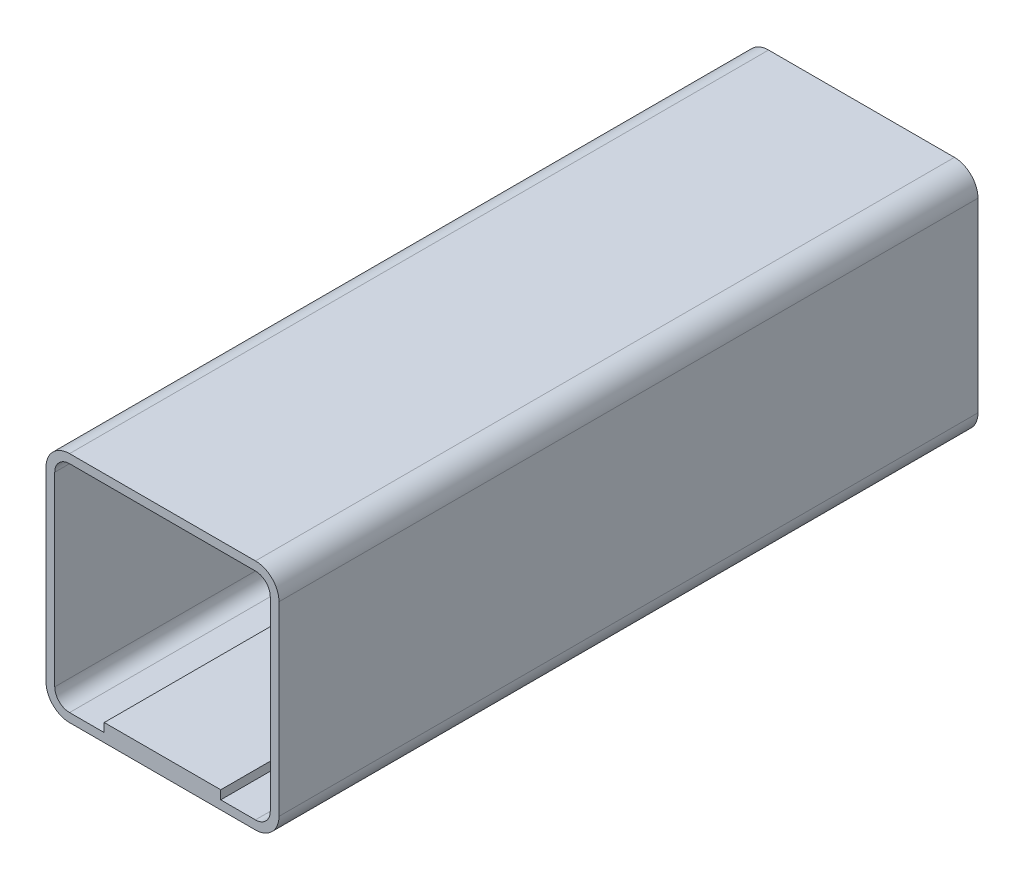
ISO-10303-21;
HEADER;
FILE_DESCRIPTION(('STEP AP214'),'2;1');
FILE_NAME('part.step','',(''),(''),'','','');
FILE_SCHEMA(('AUTOMOTIVE_DESIGN { 1 0 10303 214 1 1 1 1 }'));
ENDSEC;
DATA;
#1=APPLICATION_CONTEXT('core data for automotive mechanical design processes');
#2=APPLICATION_PROTOCOL_DEFINITION('international standard','automotive_design',2000,#1);
#3=PRODUCT_CONTEXT('',#1,'mechanical');
#4=PRODUCT('Part','Part','',(#3));
#5=PRODUCT_RELATED_PRODUCT_CATEGORY('part','',(#4));
#6=PRODUCT_DEFINITION_FORMATION('','',#4);
#7=PRODUCT_DEFINITION_CONTEXT('part definition',#1,'design');
#8=PRODUCT_DEFINITION('design','',#6,#7);
#9=PRODUCT_DEFINITION_SHAPE('','',#8);
#10=(LENGTH_UNIT() NAMED_UNIT(*) SI_UNIT(.MILLI.,.METRE.));
#11=(NAMED_UNIT(*) PLANE_ANGLE_UNIT() SI_UNIT($,.RADIAN.));
#12=(NAMED_UNIT(*) SI_UNIT($,.STERADIAN.) SOLID_ANGLE_UNIT());
#13=UNCERTAINTY_MEASURE_WITH_UNIT(LENGTH_MEASURE(1.E-05),#10,'distance_accuracy_value','');
#14=(GEOMETRIC_REPRESENTATION_CONTEXT(3) GLOBAL_UNCERTAINTY_ASSIGNED_CONTEXT((#13)) GLOBAL_UNIT_ASSIGNED_CONTEXT((#10,
#11,#12)) REPRESENTATION_CONTEXT('',''));
#15=CARTESIAN_POINT('',(0.,0.,0.));
#16=DIRECTION('',(0.,0.,1.));
#17=DIRECTION('',(1.,0.,0.));
#18=AXIS2_PLACEMENT_3D('',#15,#16,#17);
#19=CARTESIAN_POINT('',(-50.6524288909317,-58.7375,-381.));
#20=DIRECTION('',(0.,-1.,0.));
#21=DIRECTION('',(1.,0.,0.));
#22=AXIS2_PLACEMENT_3D('',#19,#20,#21);
#23=PLANE('',#22);
#24=DIRECTION('',(1.,0.,0.));
#25=VECTOR('',#24,1.);
#26=CARTESIAN_POINT('',(-50.6524288909317,-58.7375,0.));
#27=LINE('',#26,#25);
#28=CARTESIAN_POINT('',(-50.6524288909317,-58.7375,0.));
#29=VERTEX_POINT('',#28);
#30=CARTESIAN_POINT('',(-31.75,-58.7375,0.));
#31=VERTEX_POINT('',#30);
#32=EDGE_CURVE('E247',#29,#31,#27,.T.);
#33=ORIENTED_EDGE('',*,*,#32,.T.);
#34=DIRECTION('',(0.,0.,1.));
#35=VECTOR('',#34,1.);
#36=CARTESIAN_POINT('',(-31.75,-58.7375,-444.678343306418));
#37=LINE('',#36,#35);
#38=CARTESIAN_POINT('',(-31.75,-58.7375,-381.));
#39=VERTEX_POINT('',#38);
#40=EDGE_CURVE('E191',#39,#31,#37,.T.);
#41=ORIENTED_EDGE('',*,*,#40,.F.);
#42=DIRECTION('',(1.,0.,0.));
#43=VECTOR('',#42,1.);
#44=CARTESIAN_POINT('',(-50.6524288909317,-58.7375,-381.));
#45=LINE('',#44,#43);
#46=CARTESIAN_POINT('',(-50.6524288909317,-58.7375,-381.));
#47=VERTEX_POINT('',#46);
#48=EDGE_CURVE('E188',#47,#39,#45,.T.);
#49=ORIENTED_EDGE('',*,*,#48,.F.);
#50=DIRECTION('',(0.,0.,1.));
#51=VECTOR('',#50,1.);
#52=CARTESIAN_POINT('',(-50.6524288909317,-58.7375,-381.));
#53=LINE('',#52,#51);
#54=EDGE_CURVE('E235',#47,#29,#53,.T.);
#55=ORIENTED_EDGE('',*,*,#54,.T.);
#56=EDGE_LOOP('',(#33,#41,#49,#55));
#57=FACE_BOUND('',#56,.T.);
#58=ADVANCED_FACE('F40',(#57),#23,.F.);
#59=CARTESIAN_POINT('',(-50.6524288909317,50.6524288909317,-381.));
#60=DIRECTION('',(0.,0.,1.));
#61=DIRECTION('',(1.,0.,0.));
#62=AXIS2_PLACEMENT_3D('',#59,#60,#61);
#63=CYLINDRICAL_SURFACE('',#62,12.8475711090683);
#64=CARTESIAN_POINT('',(-50.6524288909317,50.6524288909317,0.));
#65=DIRECTION('',(0.,0.,-1.));
#66=DIRECTION('',(-1.,0.,0.));
#67=AXIS2_PLACEMENT_3D('',#64,#65,#66);
#68=CIRCLE('',#67,12.8475711090683);
#69=CARTESIAN_POINT('',(-63.5,50.6524288909317,0.));
#70=VERTEX_POINT('',#69);
#71=CARTESIAN_POINT('',(-50.6524288909317,63.5,0.));
#72=VERTEX_POINT('',#71);
#73=EDGE_CURVE('E221',#70,#72,#68,.T.);
#74=ORIENTED_EDGE('',*,*,#73,.T.);
#75=DIRECTION('',(0.,0.,1.));
#76=VECTOR('',#75,1.);
#77=CARTESIAN_POINT('',(-50.6524288909317,63.5,-381.));
#78=LINE('',#77,#76);
#79=CARTESIAN_POINT('',(-50.6524288909317,63.5,-381.));
#80=VERTEX_POINT('',#79);
#81=EDGE_CURVE('E11',#80,#72,#78,.T.);
#82=ORIENTED_EDGE('',*,*,#81,.F.);
#83=CARTESIAN_POINT('',(-50.6524288909317,50.6524288909317,-381.));
#84=DIRECTION('',(0.,0.,-1.));
#85=DIRECTION('',(-1.,0.,0.));
#86=AXIS2_PLACEMENT_3D('',#83,#84,#85);
#87=CIRCLE('',#86,12.8475711090683);
#88=CARTESIAN_POINT('',(-63.5,50.6524288909317,-381.));
#89=VERTEX_POINT('',#88);
#90=EDGE_CURVE('E278',#89,#80,#87,.T.);
#91=ORIENTED_EDGE('',*,*,#90,.F.);
#92=DIRECTION('',(0.,0.,1.));
#93=VECTOR('',#92,1.);
#94=CARTESIAN_POINT('',(-63.5,50.6524288909317,-381.));
#95=LINE('',#94,#93);
#96=EDGE_CURVE('E300',#89,#70,#95,.T.);
#97=ORIENTED_EDGE('',*,*,#96,.T.);
#98=EDGE_LOOP('',(#74,#82,#91,#97));
#99=FACE_BOUND('',#98,.T.);
#100=ADVANCED_FACE('F42',(#99),#63,.T.);
#101=CARTESIAN_POINT('',(-50.6524288909317,63.5,-381.));
#102=DIRECTION('',(0.,-1.,0.));
#103=DIRECTION('',(0.,0.,-1.));
#104=AXIS2_PLACEMENT_3D('',#101,#102,#103);
#105=PLANE('',#104);
#106=DIRECTION('',(1.,0.,0.));
#107=VECTOR('',#106,1.);
#108=CARTESIAN_POINT('',(-50.6524288909317,63.5,0.));
#109=LINE('',#108,#107);
#110=CARTESIAN_POINT('',(50.6524288909317,63.5,0.));
#111=VERTEX_POINT('',#110);
#112=EDGE_CURVE('E303',#72,#111,#109,.T.);
#113=ORIENTED_EDGE('',*,*,#112,.T.);
#114=DIRECTION('',(0.,0.,1.));
#115=VECTOR('',#114,1.);
#116=CARTESIAN_POINT('',(50.6524288909317,63.5,-381.));
#117=LINE('',#116,#115);
#118=CARTESIAN_POINT('',(50.6524288909317,63.5,-381.));
#119=VERTEX_POINT('',#118);
#120=EDGE_CURVE('E48',#119,#111,#117,.T.);
#121=ORIENTED_EDGE('',*,*,#120,.F.);
#122=DIRECTION('',(1.,0.,0.));
#123=VECTOR('',#122,1.);
#124=CARTESIAN_POINT('',(-50.6524288909317,63.5,-381.));
#125=LINE('',#124,#123);
#126=EDGE_CURVE('E281',#80,#119,#125,.T.);
#127=ORIENTED_EDGE('',*,*,#126,.F.);
#128=ORIENTED_EDGE('',*,*,#81,.T.);
#129=EDGE_LOOP('',(#113,#121,#127,#128));
#130=FACE_BOUND('',#129,.T.);
#131=ADVANCED_FACE('F339',(#130),#105,.F.);
#132=CARTESIAN_POINT('',(50.6524288909317,50.6524288909317,-381.));
#133=DIRECTION('',(0.,0.,1.));
#134=DIRECTION('',(1.,0.,0.));
#135=AXIS2_PLACEMENT_3D('',#132,#133,#134);
#136=CYLINDRICAL_SURFACE('',#135,12.8475711090683);
#137=CARTESIAN_POINT('',(50.6524288909317,50.6524288909317,0.));
#138=DIRECTION('',(0.,0.,1.));
#139=DIRECTION('',(1.,0.,0.));
#140=AXIS2_PLACEMENT_3D('',#137,#138,#139);
#141=CIRCLE('',#140,12.8475711090683);
#142=CARTESIAN_POINT('',(63.5,50.6524288909317,0.));
#143=VERTEX_POINT('',#142);
#144=EDGE_CURVE('E306',#143,#111,#141,.T.);
#145=ORIENTED_EDGE('',*,*,#144,.F.);
#146=DIRECTION('',(0.,0.,1.));
#147=VECTOR('',#146,1.);
#148=CARTESIAN_POINT('',(63.5,50.6524288909317,-381.));
#149=LINE('',#148,#147);
#150=CARTESIAN_POINT('',(63.5,50.6524288909317,-381.));
#151=VERTEX_POINT('',#150);
#152=EDGE_CURVE('E332',#151,#143,#149,.T.);
#153=ORIENTED_EDGE('',*,*,#152,.F.);
#154=CARTESIAN_POINT('',(50.6524288909317,50.6524288909317,-381.));
#155=DIRECTION('',(0.,0.,1.));
#156=DIRECTION('',(1.,0.,0.));
#157=AXIS2_PLACEMENT_3D('',#154,#155,#156);
#158=CIRCLE('',#157,12.8475711090683);
#159=EDGE_CURVE('E284',#151,#119,#158,.T.);
#160=ORIENTED_EDGE('',*,*,#159,.T.);
#161=ORIENTED_EDGE('',*,*,#120,.T.);
#162=EDGE_LOOP('',(#145,#153,#160,#161));
#163=FACE_BOUND('',#162,.T.);
#164=ADVANCED_FACE('F336',(#163),#136,.T.);
#165=CARTESIAN_POINT('',(63.5,50.6524288909317,-381.));
#166=DIRECTION('',(-1.,0.,0.));
#167=DIRECTION('',(0.,-1.,0.));
#168=AXIS2_PLACEMENT_3D('',#165,#166,#167);
#169=PLANE('',#168);
#170=DIRECTION('',(0.,-1.,0.));
#171=VECTOR('',#170,1.);
#172=CARTESIAN_POINT('',(63.5,50.6524288909317,0.));
#173=LINE('',#172,#171);
#174=CARTESIAN_POINT('',(63.5,-50.6524288909317,0.));
#175=VERTEX_POINT('',#174);
#176=EDGE_CURVE('E309',#143,#175,#173,.T.);
#177=ORIENTED_EDGE('',*,*,#176,.T.);
#178=DIRECTION('',(0.,0.,1.));
#179=VECTOR('',#178,1.);
#180=CARTESIAN_POINT('',(63.5,-50.6524288909317,-381.));
#181=LINE('',#180,#179);
#182=CARTESIAN_POINT('',(63.5,-50.6524288909317,-381.));
#183=VERTEX_POINT('',#182);
#184=EDGE_CURVE('E330',#183,#175,#181,.T.);
#185=ORIENTED_EDGE('',*,*,#184,.F.);
#186=DIRECTION('',(0.,-1.,0.));
#187=VECTOR('',#186,1.);
#188=CARTESIAN_POINT('',(63.5,50.6524288909317,-381.));
#189=LINE('',#188,#187);
#190=EDGE_CURVE('E287',#151,#183,#189,.T.);
#191=ORIENTED_EDGE('',*,*,#190,.F.);
#192=ORIENTED_EDGE('',*,*,#152,.T.);
#193=EDGE_LOOP('',(#177,#185,#191,#192));
#194=FACE_BOUND('',#193,.T.);
#195=ADVANCED_FACE('F348',(#194),#169,.F.);
#196=CARTESIAN_POINT('',(50.6524288909317,-50.6524288909317,-381.));
#197=DIRECTION('',(0.,0.,1.));
#198=DIRECTION('',(1.,0.,0.));
#199=AXIS2_PLACEMENT_3D('',#196,#197,#198);
#200=CYLINDRICAL_SURFACE('',#199,12.8475711090683);
#201=CARTESIAN_POINT('',(50.6524288909317,-50.6524288909317,0.));
#202=DIRECTION('',(0.,0.,1.));
#203=DIRECTION('',(1.,0.,0.));
#204=AXIS2_PLACEMENT_3D('',#201,#202,#203);
#205=CIRCLE('',#204,12.8475711090683);
#206=CARTESIAN_POINT('',(50.6524288909317,-63.5,0.));
#207=VERTEX_POINT('',#206);
#208=EDGE_CURVE('E312',#207,#175,#205,.T.);
#209=ORIENTED_EDGE('',*,*,#208,.F.);
#210=DIRECTION('',(0.,0.,1.));
#211=VECTOR('',#210,1.);
#212=CARTESIAN_POINT('',(50.6524288909317,-63.5,-381.));
#213=LINE('',#212,#211);
#214=CARTESIAN_POINT('',(50.6524288909317,-63.5,-381.));
#215=VERTEX_POINT('',#214);
#216=EDGE_CURVE('E328',#215,#207,#213,.T.);
#217=ORIENTED_EDGE('',*,*,#216,.F.);
#218=CARTESIAN_POINT('',(50.6524288909317,-50.6524288909317,-381.));
#219=DIRECTION('',(0.,0.,1.));
#220=DIRECTION('',(1.,0.,0.));
#221=AXIS2_PLACEMENT_3D('',#218,#219,#220);
#222=CIRCLE('',#221,12.8475711090683);
#223=EDGE_CURVE('E289',#215,#183,#222,.T.);
#224=ORIENTED_EDGE('',*,*,#223,.T.);
#225=ORIENTED_EDGE('',*,*,#184,.T.);
#226=EDGE_LOOP('',(#209,#217,#224,#225));
#227=FACE_BOUND('',#226,.T.);
#228=ADVANCED_FACE('F367',(#227),#200,.T.);
#229=CARTESIAN_POINT('',(-50.6524288909317,-63.5,-381.));
#230=DIRECTION('',(0.,-1.,0.));
#231=DIRECTION('',(1.,0.,0.));
#232=AXIS2_PLACEMENT_3D('',#229,#230,#231);
#233=PLANE('',#232);
#234=DIRECTION('',(1.,0.,0.));
#235=VECTOR('',#234,1.);
#236=CARTESIAN_POINT('',(-50.6524288909317,-63.5,0.));
#237=LINE('',#236,#235);
#238=CARTESIAN_POINT('',(-50.6524288909317,-63.5,0.));
#239=VERTEX_POINT('',#238);
#240=EDGE_CURVE('E315',#239,#207,#237,.T.);
#241=ORIENTED_EDGE('',*,*,#240,.F.);
#242=DIRECTION('',(0.,0.,1.));
#243=VECTOR('',#242,1.);
#244=CARTESIAN_POINT('',(-50.6524288909317,-63.5,-381.));
#245=LINE('',#244,#243);
#246=CARTESIAN_POINT('',(-50.6524288909317,-63.5,-381.));
#247=VERTEX_POINT('',#246);
#248=EDGE_CURVE('E326',#247,#239,#245,.T.);
#249=ORIENTED_EDGE('',*,*,#248,.F.);
#250=DIRECTION('',(1.,0.,0.));
#251=VECTOR('',#250,1.);
#252=CARTESIAN_POINT('',(-50.6524288909317,-63.5,-381.));
#253=LINE('',#252,#251);
#254=EDGE_CURVE('E292',#247,#215,#253,.T.);
#255=ORIENTED_EDGE('',*,*,#254,.T.);
#256=ORIENTED_EDGE('',*,*,#216,.T.);
#257=EDGE_LOOP('',(#241,#249,#255,#256));
#258=FACE_BOUND('',#257,.T.);
#259=ADVANCED_FACE('F364',(#258),#233,.T.);
#260=CARTESIAN_POINT('',(-50.6524288909317,-50.6524288909317,-381.));
#261=DIRECTION('',(0.,0.,1.));
#262=DIRECTION('',(1.,0.,0.));
#263=AXIS2_PLACEMENT_3D('',#260,#261,#262);
#264=CYLINDRICAL_SURFACE('',#263,12.8475711090683);
#265=CARTESIAN_POINT('',(-50.6524288909317,-50.6524288909317,0.));
#266=DIRECTION('',(0.,0.,-1.));
#267=DIRECTION('',(-1.,0.,0.));
#268=AXIS2_PLACEMENT_3D('',#265,#266,#267);
#269=CIRCLE('',#268,12.8475711090683);
#270=CARTESIAN_POINT('',(-63.5,-50.6524288909317,0.));
#271=VERTEX_POINT('',#270);
#272=EDGE_CURVE('E318',#239,#271,#269,.T.);
#273=ORIENTED_EDGE('',*,*,#272,.T.);
#274=DIRECTION('',(0.,0.,1.));
#275=VECTOR('',#274,1.);
#276=CARTESIAN_POINT('',(-63.5,-50.6524288909317,-381.));
#277=LINE('',#276,#275);
#278=CARTESIAN_POINT('',(-63.5,-50.6524288909317,-381.));
#279=VERTEX_POINT('',#278);
#280=EDGE_CURVE('E324',#279,#271,#277,.T.);
#281=ORIENTED_EDGE('',*,*,#280,.F.);
#282=CARTESIAN_POINT('',(-50.6524288909317,-50.6524288909317,-381.));
#283=DIRECTION('',(0.,0.,-1.));
#284=DIRECTION('',(-1.,0.,0.));
#285=AXIS2_PLACEMENT_3D('',#282,#283,#284);
#286=CIRCLE('',#285,12.8475711090683);
#287=EDGE_CURVE('E295',#247,#279,#286,.T.);
#288=ORIENTED_EDGE('',*,*,#287,.F.);
#289=ORIENTED_EDGE('',*,*,#248,.T.);
#290=EDGE_LOOP('',(#273,#281,#288,#289));
#291=FACE_BOUND('',#290,.T.);
#292=ADVANCED_FACE('F361',(#291),#264,.T.);
#293=CARTESIAN_POINT('',(-63.5,50.6524288909317,-381.));
#294=DIRECTION('',(-1.,0.,0.));
#295=DIRECTION('',(0.,0.,1.));
#296=AXIS2_PLACEMENT_3D('',#293,#294,#295);
#297=PLANE('',#296);
#298=DIRECTION('',(0.,-1.,0.));
#299=VECTOR('',#298,1.);
#300=CARTESIAN_POINT('',(-63.5,50.6524288909317,0.));
#301=LINE('',#300,#299);
#302=EDGE_CURVE('E282',#70,#271,#301,.T.);
#303=ORIENTED_EDGE('',*,*,#302,.F.);
#304=ORIENTED_EDGE('',*,*,#96,.F.);
#305=DIRECTION('',(0.,-1.,0.));
#306=VECTOR('',#305,1.);
#307=CARTESIAN_POINT('',(-63.5,50.6524288909317,-381.));
#308=LINE('',#307,#306);
#309=EDGE_CURVE('E297',#89,#279,#308,.T.);
#310=ORIENTED_EDGE('',*,*,#309,.T.);
#311=ORIENTED_EDGE('',*,*,#280,.T.);
#312=EDGE_LOOP('',(#303,#304,#310,#311));
#313=FACE_BOUND('',#312,.T.);
#314=ADVANCED_FACE('F357',(#313),#297,.T.);
#315=CARTESIAN_POINT('',(-50.6524288909317,50.6524288909317,-381.));
#316=DIRECTION('',(0.,0.,-1.));
#317=DIRECTION('',(-1.,0.,0.));
#318=AXIS2_PLACEMENT_3D('',#315,#316,#317);
#319=PLANE('',#318);
#320=CARTESIAN_POINT('',(-50.6524288909317,50.6524288909317,-381.));
#321=DIRECTION('',(0.,0.,-1.));
#322=DIRECTION('',(-1.,0.,0.));
#323=AXIS2_PLACEMENT_3D('',#320,#321,#322);
#324=CIRCLE('',#323,8.08507110906827);
#325=CARTESIAN_POINT('',(-58.7375,50.6524288909317,-381.));
#326=VERTEX_POINT('',#325);
#327=CARTESIAN_POINT('',(-50.6524288909317,58.7375,-381.));
#328=VERTEX_POINT('',#327);
#329=EDGE_CURVE('E243',#326,#328,#324,.T.);
#330=ORIENTED_EDGE('',*,*,#329,.F.);
#331=DIRECTION('',(0.,-1.,0.));
#332=VECTOR('',#331,1.);
#333=CARTESIAN_POINT('',(-58.7375,50.6524288909317,-381.));
#334=LINE('',#333,#332);
#335=CARTESIAN_POINT('',(-58.7375,-50.6524288909317,-381.));
#336=VERTEX_POINT('',#335);
#337=EDGE_CURVE('E225',#326,#336,#334,.T.);
#338=ORIENTED_EDGE('',*,*,#337,.T.);
#339=CARTESIAN_POINT('',(-50.6524288909317,-50.6524288909317,-381.));
#340=DIRECTION('',(0.,0.,-1.));
#341=DIRECTION('',(-1.,0.,0.));
#342=AXIS2_PLACEMENT_3D('',#339,#340,#341);
#343=CIRCLE('',#342,8.0850711090683);
#344=EDGE_CURVE('E274',#47,#336,#343,.T.);
#345=ORIENTED_EDGE('',*,*,#344,.F.);
#346=ORIENTED_EDGE('',*,*,#48,.T.);
#347=DIRECTION('',(0.,-1.,0.));
#348=VECTOR('',#347,1.);
#349=CARTESIAN_POINT('',(-31.75,-58.7375,-381.));
#350=LINE('',#349,#348);
#351=CARTESIAN_POINT('',(-31.75,-53.975,-381.));
#352=VERTEX_POINT('',#351);
#353=EDGE_CURVE('E178',#352,#39,#350,.T.);
#354=ORIENTED_EDGE('',*,*,#353,.F.);
#355=DIRECTION('',(-1.,0.,0.));
#356=VECTOR('',#355,1.);
#357=CARTESIAN_POINT('',(-31.75,-53.975,-381.));
#358=LINE('',#357,#356);
#359=CARTESIAN_POINT('',(31.75,-53.975,-381.));
#360=VERTEX_POINT('',#359);
#361=EDGE_CURVE('E184',#360,#352,#358,.T.);
#362=ORIENTED_EDGE('',*,*,#361,.F.);
#363=DIRECTION('',(0.,1.,0.));
#364=VECTOR('',#363,1.);
#365=CARTESIAN_POINT('',(31.75,-53.975,-381.));
#366=LINE('',#365,#364);
#367=CARTESIAN_POINT('',(31.75,-58.7375,-381.));
#368=VERTEX_POINT('',#367);
#369=EDGE_CURVE('E211',#368,#360,#366,.T.);
#370=ORIENTED_EDGE('',*,*,#369,.F.);
#371=CARTESIAN_POINT('',(50.6524288909317,-58.7375,-381.));
#372=VERTEX_POINT('',#371);
#373=EDGE_CURVE('E272',#368,#372,#45,.T.);
#374=ORIENTED_EDGE('',*,*,#373,.T.);
#375=CARTESIAN_POINT('',(50.6524288909317,-50.6524288909317,-381.));
#376=DIRECTION('',(0.,0.,-1.));
#377=DIRECTION('',(-1.,0.,0.));
#378=AXIS2_PLACEMENT_3D('',#375,#376,#377);
#379=CIRCLE('',#378,8.0850711090683);
#380=CARTESIAN_POINT('',(58.7375,-50.6524288909317,-381.));
#381=VERTEX_POINT('',#380);
#382=EDGE_CURVE('E269',#372,#381,#379,.F.);
#383=ORIENTED_EDGE('',*,*,#382,.T.);
#384=DIRECTION('',(0.,-1.,0.));
#385=VECTOR('',#384,1.);
#386=CARTESIAN_POINT('',(58.7375,50.6524288909317,-381.));
#387=LINE('',#386,#385);
#388=CARTESIAN_POINT('',(58.7375,50.6524288909317,-381.));
#389=VERTEX_POINT('',#388);
#390=EDGE_CURVE('E267',#389,#381,#387,.T.);
#391=ORIENTED_EDGE('',*,*,#390,.F.);
#392=CARTESIAN_POINT('',(50.6524288909317,50.6524288909317,-381.));
#393=DIRECTION('',(0.,0.,-1.));
#394=DIRECTION('',(-1.,0.,0.));
#395=AXIS2_PLACEMENT_3D('',#392,#393,#394);
#396=CIRCLE('',#395,8.08507110906828);
#397=CARTESIAN_POINT('',(50.6524288909317,58.7375,-381.));
#398=VERTEX_POINT('',#397);
#399=EDGE_CURVE('E264',#389,#398,#396,.F.);
#400=ORIENTED_EDGE('',*,*,#399,.T.);
#401=DIRECTION('',(1.,0.,0.));
#402=VECTOR('',#401,1.);
#403=CARTESIAN_POINT('',(-50.6524288909317,58.7375,-381.));
#404=LINE('',#403,#402);
#405=EDGE_CURVE('E262',#328,#398,#404,.T.);
#406=ORIENTED_EDGE('',*,*,#405,.F.);
#407=EDGE_LOOP('',(#330,#338,#345,#346,#354,#362,#370,#374,#383,#391,#400,#406));
#408=FACE_BOUND('',#407,.T.);
#409=ORIENTED_EDGE('',*,*,#90,.T.);
#410=ORIENTED_EDGE('',*,*,#126,.T.);
#411=ORIENTED_EDGE('',*,*,#159,.F.);
#412=ORIENTED_EDGE('',*,*,#190,.T.);
#413=ORIENTED_EDGE('',*,*,#223,.F.);
#414=ORIENTED_EDGE('',*,*,#254,.F.);
#415=ORIENTED_EDGE('',*,*,#287,.T.);
#416=ORIENTED_EDGE('',*,*,#309,.F.);
#417=EDGE_LOOP('',(#409,#410,#411,#412,#413,#414,#415,#416));
#418=FACE_BOUND('',#417,.T.);
#419=ADVANCED_FACE('F181',(#408,#418),#319,.T.);
#420=CARTESIAN_POINT('',(-50.6524288909317,50.6524288909317,0.));
#421=DIRECTION('',(0.,0.,-1.));
#422=DIRECTION('',(-1.,0.,0.));
#423=AXIS2_PLACEMENT_3D('',#420,#421,#422);
#424=PLANE('',#423);
#425=DIRECTION('',(0.,-1.,0.));
#426=VECTOR('',#425,1.);
#427=CARTESIAN_POINT('',(-58.7375,50.6524288909317,0.));
#428=LINE('',#427,#426);
#429=CARTESIAN_POINT('',(-58.7375,50.6524288909317,0.));
#430=VERTEX_POINT('',#429);
#431=CARTESIAN_POINT('',(-58.7375,-50.6524288909317,0.));
#432=VERTEX_POINT('',#431);
#433=EDGE_CURVE('E241',#430,#432,#428,.T.);
#434=ORIENTED_EDGE('',*,*,#433,.F.);
#435=CARTESIAN_POINT('',(-50.6524288909317,50.6524288909317,0.));
#436=DIRECTION('',(0.,0.,-1.));
#437=DIRECTION('',(-1.,0.,0.));
#438=AXIS2_PLACEMENT_3D('',#435,#436,#437);
#439=CIRCLE('',#438,8.08507110906827);
#440=CARTESIAN_POINT('',(-50.6524288909317,58.7375,0.));
#441=VERTEX_POINT('',#440);
#442=EDGE_CURVE('E217',#430,#441,#439,.T.);
#443=ORIENTED_EDGE('',*,*,#442,.T.);
#444=DIRECTION('',(1.,0.,0.));
#445=VECTOR('',#444,1.);
#446=CARTESIAN_POINT('',(-50.6524288909317,58.7375,0.));
#447=LINE('',#446,#445);
#448=CARTESIAN_POINT('',(50.6524288909317,58.7375,0.));
#449=VERTEX_POINT('',#448);
#450=EDGE_CURVE('E240',#441,#449,#447,.T.);
#451=ORIENTED_EDGE('',*,*,#450,.T.);
#452=CARTESIAN_POINT('',(50.6524288909317,50.6524288909317,0.));
#453=DIRECTION('',(0.,0.,-1.));
#454=DIRECTION('',(-1.,0.,0.));
#455=AXIS2_PLACEMENT_3D('',#452,#453,#454);
#456=CIRCLE('',#455,8.08507110906828);
#457=CARTESIAN_POINT('',(58.7375,50.6524288909317,0.));
#458=VERTEX_POINT('',#457);
#459=EDGE_CURVE('E257',#458,#449,#456,.F.);
#460=ORIENTED_EDGE('',*,*,#459,.F.);
#461=DIRECTION('',(0.,-1.,0.));
#462=VECTOR('',#461,1.);
#463=CARTESIAN_POINT('',(58.7375,50.6524288909317,0.));
#464=LINE('',#463,#462);
#465=CARTESIAN_POINT('',(58.7375,-50.6524288909317,0.));
#466=VERTEX_POINT('',#465);
#467=EDGE_CURVE('E254',#458,#466,#464,.T.);
#468=ORIENTED_EDGE('',*,*,#467,.T.);
#469=CARTESIAN_POINT('',(50.6524288909317,-50.6524288909317,0.));
#470=DIRECTION('',(0.,0.,-1.));
#471=DIRECTION('',(-1.,0.,0.));
#472=AXIS2_PLACEMENT_3D('',#469,#470,#471);
#473=CIRCLE('',#472,8.0850711090683);
#474=CARTESIAN_POINT('',(50.6524288909317,-58.7375,0.));
#475=VERTEX_POINT('',#474);
#476=EDGE_CURVE('E251',#475,#466,#473,.F.);
#477=ORIENTED_EDGE('',*,*,#476,.F.);
#478=CARTESIAN_POINT('',(31.75,-58.7375,0.));
#479=VERTEX_POINT('',#478);
#480=EDGE_CURVE('E250',#479,#475,#27,.T.);
#481=ORIENTED_EDGE('',*,*,#480,.F.);
#482=DIRECTION('',(0.,1.,0.));
#483=VECTOR('',#482,1.);
#484=CARTESIAN_POINT('',(31.75,-53.975,0.));
#485=LINE('',#484,#483);
#486=CARTESIAN_POINT('',(31.75,-53.975,0.));
#487=VERTEX_POINT('',#486);
#488=EDGE_CURVE('E55',#479,#487,#485,.T.);
#489=ORIENTED_EDGE('',*,*,#488,.T.);
#490=DIRECTION('',(-1.,0.,0.));
#491=VECTOR('',#490,1.);
#492=CARTESIAN_POINT('',(-31.75,-53.975,0.));
#493=LINE('',#492,#491);
#494=CARTESIAN_POINT('',(-31.75,-53.975,0.));
#495=VERTEX_POINT('',#494);
#496=EDGE_CURVE('E206',#487,#495,#493,.T.);
#497=ORIENTED_EDGE('',*,*,#496,.T.);
#498=DIRECTION('',(0.,-1.,0.));
#499=VECTOR('',#498,1.);
#500=CARTESIAN_POINT('',(-31.75,-58.7375,0.));
#501=LINE('',#500,#499);
#502=EDGE_CURVE('E197',#495,#31,#501,.T.);
#503=ORIENTED_EDGE('',*,*,#502,.T.);
#504=ORIENTED_EDGE('',*,*,#32,.F.);
#505=CARTESIAN_POINT('',(-50.6524288909317,-50.6524288909317,0.));
#506=DIRECTION('',(0.,0.,-1.));
#507=DIRECTION('',(-1.,0.,0.));
#508=AXIS2_PLACEMENT_3D('',#505,#506,#507);
#509=CIRCLE('',#508,8.0850711090683);
#510=EDGE_CURVE('E244',#29,#432,#509,.T.);
#511=ORIENTED_EDGE('',*,*,#510,.T.);
#512=EDGE_LOOP('',(#434,#443,#451,#460,#468,#477,#481,#489,#497,#503,#504,#511));
#513=FACE_BOUND('',#512,.T.);
#514=ORIENTED_EDGE('',*,*,#73,.F.);
#515=ORIENTED_EDGE('',*,*,#302,.T.);
#516=ORIENTED_EDGE('',*,*,#272,.F.);
#517=ORIENTED_EDGE('',*,*,#240,.T.);
#518=ORIENTED_EDGE('',*,*,#208,.T.);
#519=ORIENTED_EDGE('',*,*,#176,.F.);
#520=ORIENTED_EDGE('',*,*,#144,.T.);
#521=ORIENTED_EDGE('',*,*,#112,.F.);
#522=EDGE_LOOP('',(#514,#515,#516,#517,#518,#519,#520,#521));
#523=FACE_BOUND('',#522,.T.);
#524=ADVANCED_FACE('F344',(#513,#523),#424,.F.);
#525=CARTESIAN_POINT('',(-50.6524288909317,50.6524288909317,-381.));
#526=DIRECTION('',(0.,0.,1.));
#527=DIRECTION('',(1.,0.,0.));
#528=AXIS2_PLACEMENT_3D('',#525,#526,#527);
#529=CYLINDRICAL_SURFACE('',#528,8.08507110906827);
#530=ORIENTED_EDGE('',*,*,#442,.F.);
#531=DIRECTION('',(0.,0.,1.));
#532=VECTOR('',#531,1.);
#533=CARTESIAN_POINT('',(-58.7375,50.6524288909317,-381.));
#534=LINE('',#533,#532);
#535=EDGE_CURVE('E223',#326,#430,#534,.T.);
#536=ORIENTED_EDGE('',*,*,#535,.F.);
#537=ORIENTED_EDGE('',*,*,#329,.T.);
#538=DIRECTION('',(0.,0.,-1.));
#539=VECTOR('',#538,1.);
#540=CARTESIAN_POINT('',(-50.6524288909317,58.7375,-381.));
#541=LINE('',#540,#539);
#542=EDGE_CURVE('E218',#328,#441,#541,.F.);
#543=ORIENTED_EDGE('',*,*,#542,.T.);
#544=EDGE_LOOP('',(#530,#536,#537,#543));
#545=FACE_BOUND('',#544,.T.);
#546=ADVANCED_FACE('F415',(#545),#529,.F.);
#547=CARTESIAN_POINT('',(-50.6524288909317,58.7375,-381.));
#548=DIRECTION('',(0.,-1.,0.));
#549=DIRECTION('',(0.,0.,-1.));
#550=AXIS2_PLACEMENT_3D('',#547,#548,#549);
#551=PLANE('',#550);
#552=ORIENTED_EDGE('',*,*,#450,.F.);
#553=ORIENTED_EDGE('',*,*,#542,.F.);
#554=ORIENTED_EDGE('',*,*,#405,.T.);
#555=DIRECTION('',(0.,0.,1.));
#556=VECTOR('',#555,1.);
#557=CARTESIAN_POINT('',(50.6524288909317,58.7375,-381.));
#558=LINE('',#557,#556);
#559=EDGE_CURVE('E222',#398,#449,#558,.T.);
#560=ORIENTED_EDGE('',*,*,#559,.T.);
#561=EDGE_LOOP('',(#552,#553,#554,#560));
#562=FACE_BOUND('',#561,.T.);
#563=ADVANCED_FACE('F418',(#562),#551,.T.);
#564=CARTESIAN_POINT('',(50.6524288909317,50.6524288909317,-381.));
#565=DIRECTION('',(0.,0.,1.));
#566=DIRECTION('',(1.,0.,0.));
#567=AXIS2_PLACEMENT_3D('',#564,#565,#566);
#568=CYLINDRICAL_SURFACE('',#567,8.08507110906828);
#569=ORIENTED_EDGE('',*,*,#459,.T.);
#570=ORIENTED_EDGE('',*,*,#559,.F.);
#571=ORIENTED_EDGE('',*,*,#399,.F.);
#572=DIRECTION('',(0.,0.,1.));
#573=VECTOR('',#572,1.);
#574=CARTESIAN_POINT('',(58.7375,50.6524288909317,-381.));
#575=LINE('',#574,#573);
#576=EDGE_CURVE('E228',#389,#458,#575,.T.);
#577=ORIENTED_EDGE('',*,*,#576,.T.);
#578=EDGE_LOOP('',(#569,#570,#571,#577));
#579=FACE_BOUND('',#578,.T.);
#580=ADVANCED_FACE('F422',(#579),#568,.F.);
#581=CARTESIAN_POINT('',(58.7375,50.6524288909317,-381.));
#582=DIRECTION('',(-1.,0.,0.));
#583=DIRECTION('',(0.,-1.,0.));
#584=AXIS2_PLACEMENT_3D('',#581,#582,#583);
#585=PLANE('',#584);
#586=ORIENTED_EDGE('',*,*,#467,.F.);
#587=ORIENTED_EDGE('',*,*,#576,.F.);
#588=ORIENTED_EDGE('',*,*,#390,.T.);
#589=DIRECTION('',(0.,0.,1.));
#590=VECTOR('',#589,1.);
#591=CARTESIAN_POINT('',(58.7375,-50.6524288909317,-381.));
#592=LINE('',#591,#590);
#593=EDGE_CURVE('E230',#381,#466,#592,.T.);
#594=ORIENTED_EDGE('',*,*,#593,.T.);
#595=EDGE_LOOP('',(#586,#587,#588,#594));
#596=FACE_BOUND('',#595,.T.);
#597=ADVANCED_FACE('F399',(#596),#585,.T.);
#598=CARTESIAN_POINT('',(50.6524288909317,-50.6524288909317,-381.));
#599=DIRECTION('',(0.,0.,1.));
#600=DIRECTION('',(1.,0.,0.));
#601=AXIS2_PLACEMENT_3D('',#598,#599,#600);
#602=CYLINDRICAL_SURFACE('',#601,8.0850711090683);
#603=ORIENTED_EDGE('',*,*,#476,.T.);
#604=ORIENTED_EDGE('',*,*,#593,.F.);
#605=ORIENTED_EDGE('',*,*,#382,.F.);
#606=DIRECTION('',(0.,0.,1.));
#607=VECTOR('',#606,1.);
#608=CARTESIAN_POINT('',(50.6524288909317,-58.7375,-381.));
#609=LINE('',#608,#607);
#610=EDGE_CURVE('E232',#372,#475,#609,.T.);
#611=ORIENTED_EDGE('',*,*,#610,.T.);
#612=EDGE_LOOP('',(#603,#604,#605,#611));
#613=FACE_BOUND('',#612,.T.);
#614=ADVANCED_FACE('F389',(#613),#602,.F.);
#615=ORIENTED_EDGE('',*,*,#373,.F.);
#616=DIRECTION('',(0.,0.,1.));
#617=VECTOR('',#616,1.);
#618=CARTESIAN_POINT('',(31.75,-58.7375,-444.678343306418));
#619=LINE('',#618,#617);
#620=EDGE_CURVE('E212',#368,#479,#619,.T.);
#621=ORIENTED_EDGE('',*,*,#620,.T.);
#622=ORIENTED_EDGE('',*,*,#480,.T.);
#623=ORIENTED_EDGE('',*,*,#610,.F.);
#624=EDGE_LOOP('',(#615,#621,#622,#623));
#625=FACE_BOUND('',#624,.T.);
#626=ADVANCED_FACE('F379',(#625),#23,.F.);
#627=CARTESIAN_POINT('',(-50.6524288909317,-50.6524288909317,-381.));
#628=DIRECTION('',(0.,0.,1.));
#629=DIRECTION('',(1.,0.,0.));
#630=AXIS2_PLACEMENT_3D('',#627,#628,#629);
#631=CYLINDRICAL_SURFACE('',#630,8.0850711090683);
#632=ORIENTED_EDGE('',*,*,#510,.F.);
#633=ORIENTED_EDGE('',*,*,#54,.F.);
#634=ORIENTED_EDGE('',*,*,#344,.T.);
#635=DIRECTION('',(0.,0.,1.));
#636=VECTOR('',#635,1.);
#637=CARTESIAN_POINT('',(-58.7375,-50.6524288909317,-381.));
#638=LINE('',#637,#636);
#639=EDGE_CURVE('E63',#336,#432,#638,.T.);
#640=ORIENTED_EDGE('',*,*,#639,.T.);
#641=EDGE_LOOP('',(#632,#633,#634,#640));
#642=FACE_BOUND('',#641,.T.);
#643=ADVANCED_FACE('F388',(#642),#631,.F.);
#644=CARTESIAN_POINT('',(-58.7375,50.6524288909317,-381.));
#645=DIRECTION('',(-1.,0.,0.));
#646=DIRECTION('',(0.,0.,1.));
#647=AXIS2_PLACEMENT_3D('',#644,#645,#646);
#648=PLANE('',#647);
#649=ORIENTED_EDGE('',*,*,#433,.T.);
#650=ORIENTED_EDGE('',*,*,#639,.F.);
#651=ORIENTED_EDGE('',*,*,#337,.F.);
#652=ORIENTED_EDGE('',*,*,#535,.T.);
#653=EDGE_LOOP('',(#649,#650,#651,#652));
#654=FACE_BOUND('',#653,.T.);
#655=ADVANCED_FACE('F396',(#654),#648,.F.);
#656=CARTESIAN_POINT('',(-31.75,-53.975,-444.678343306418));
#657=DIRECTION('',(0.,1.,0.));
#658=DIRECTION('',(0.,0.,1.));
#659=AXIS2_PLACEMENT_3D('',#656,#657,#658);
#660=PLANE('',#659);
#661=DIRECTION('',(0.,0.,1.));
#662=VECTOR('',#661,1.);
#663=CARTESIAN_POINT('',(31.75,-53.975,-444.678343306418));
#664=LINE('',#663,#662);
#665=EDGE_CURVE('E204',#360,#487,#664,.T.);
#666=ORIENTED_EDGE('',*,*,#665,.F.);
#667=ORIENTED_EDGE('',*,*,#361,.T.);
#668=DIRECTION('',(0.,0.,1.));
#669=VECTOR('',#668,1.);
#670=CARTESIAN_POINT('',(-31.75,-53.975,-444.678343306418));
#671=LINE('',#670,#669);
#672=EDGE_CURVE('E192',#352,#495,#671,.T.);
#673=ORIENTED_EDGE('',*,*,#672,.T.);
#674=ORIENTED_EDGE('',*,*,#496,.F.);
#675=EDGE_LOOP('',(#666,#667,#673,#674));
#676=FACE_BOUND('',#675,.T.);
#677=ADVANCED_FACE('F203',(#676),#660,.T.);
#678=CARTESIAN_POINT('',(-31.75,-58.7375,-444.678343306418));
#679=DIRECTION('',(-1.,0.,0.));
#680=DIRECTION('',(0.,0.,1.));
#681=AXIS2_PLACEMENT_3D('',#678,#679,#680);
#682=PLANE('',#681);
#683=ORIENTED_EDGE('',*,*,#672,.F.);
#684=ORIENTED_EDGE('',*,*,#353,.T.);
#685=ORIENTED_EDGE('',*,*,#40,.T.);
#686=ORIENTED_EDGE('',*,*,#502,.F.);
#687=EDGE_LOOP('',(#683,#684,#685,#686));
#688=FACE_BOUND('',#687,.T.);
#689=ADVANCED_FACE('F195',(#688),#682,.T.);
#690=CARTESIAN_POINT('',(31.75,-53.975,-444.678343306418));
#691=DIRECTION('',(1.,0.,0.));
#692=DIRECTION('',(0.,0.,-1.));
#693=AXIS2_PLACEMENT_3D('',#690,#691,#692);
#694=PLANE('',#693);
#695=ORIENTED_EDGE('',*,*,#620,.F.);
#696=ORIENTED_EDGE('',*,*,#369,.T.);
#697=ORIENTED_EDGE('',*,*,#665,.T.);
#698=ORIENTED_EDGE('',*,*,#488,.F.);
#699=EDGE_LOOP('',(#695,#696,#697,#698));
#700=FACE_BOUND('',#699,.T.);
#701=ADVANCED_FACE('F406',(#700),#694,.T.);
#702=CLOSED_SHELL('',(#58,#100,#131,#164,#195,#228,#259,#292,#314,#419,#524,#546,#563,#580,#597,
#614,#626,#643,#655,#677,#689,#701));
#703=MANIFOLD_SOLID_BREP('B2',#702);
#704=ADVANCED_BREP_SHAPE_REPRESENTATION('',(#18,#703),#14);
#705=SHAPE_DEFINITION_REPRESENTATION(#9,#704);
ENDSEC;
END-ISO-10303-21;
